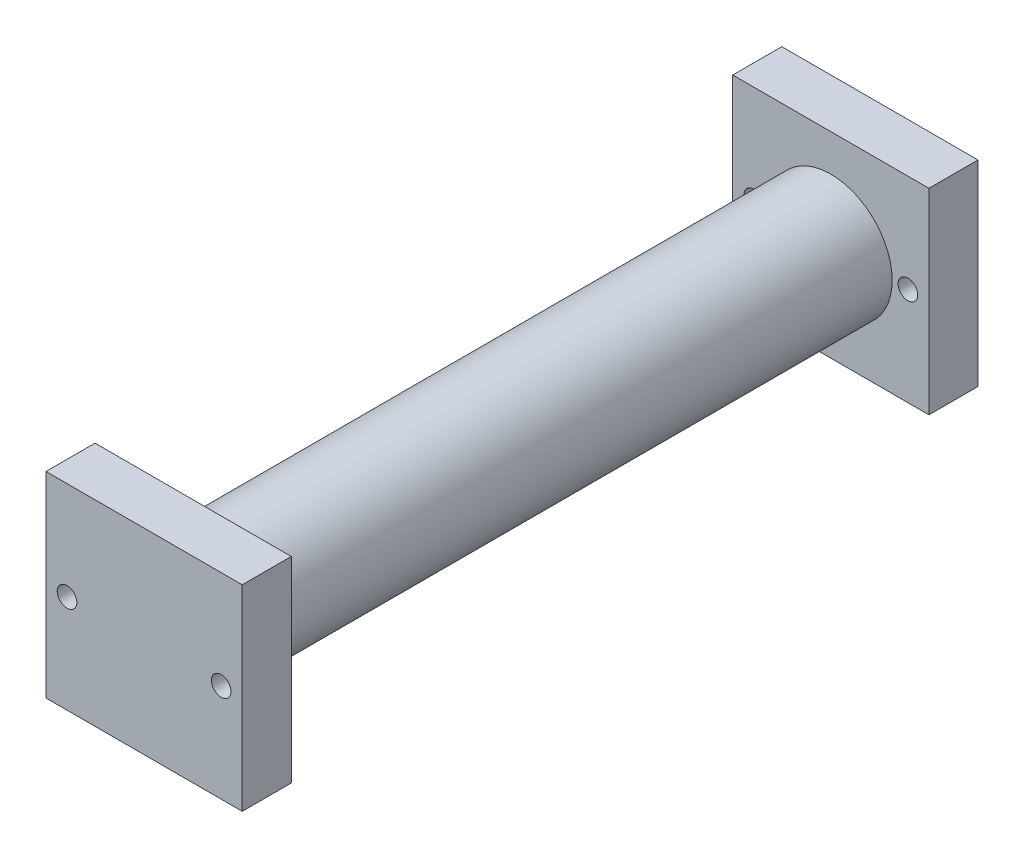
ISO-10303-21;
HEADER;
FILE_DESCRIPTION(('STEP AP214'),'2;1');
FILE_NAME('part.step','',(''),(''),'','','');
FILE_SCHEMA(('AUTOMOTIVE_DESIGN { 1 0 10303 214 1 1 1 1 }'));
ENDSEC;
DATA;
#1=APPLICATION_CONTEXT('core data for automotive mechanical design processes');
#2=APPLICATION_PROTOCOL_DEFINITION('international standard','automotive_design',2000,#1);
#3=PRODUCT_CONTEXT('',#1,'mechanical');
#4=PRODUCT('Part','Part','',(#3));
#5=PRODUCT_RELATED_PRODUCT_CATEGORY('part','',(#4));
#6=PRODUCT_DEFINITION_FORMATION('','',#4);
#7=PRODUCT_DEFINITION_CONTEXT('part definition',#1,'design');
#8=PRODUCT_DEFINITION('design','',#6,#7);
#9=PRODUCT_DEFINITION_SHAPE('','',#8);
#10=(LENGTH_UNIT() NAMED_UNIT(*) SI_UNIT(.MILLI.,.METRE.));
#11=(NAMED_UNIT(*) PLANE_ANGLE_UNIT() SI_UNIT($,.RADIAN.));
#12=(NAMED_UNIT(*) SI_UNIT($,.STERADIAN.) SOLID_ANGLE_UNIT());
#13=UNCERTAINTY_MEASURE_WITH_UNIT(LENGTH_MEASURE(1.E-05),#10,'distance_accuracy_value','');
#14=(GEOMETRIC_REPRESENTATION_CONTEXT(3) GLOBAL_UNCERTAINTY_ASSIGNED_CONTEXT((#13)) GLOBAL_UNIT_ASSIGNED_CONTEXT((#10,
#11,#12)) REPRESENTATION_CONTEXT('',''));
#15=CARTESIAN_POINT('',(0.,0.,0.));
#16=DIRECTION('',(0.,0.,1.));
#17=DIRECTION('',(1.,0.,0.));
#18=AXIS2_PLACEMENT_3D('',#15,#16,#17);
#19=CARTESIAN_POINT('',(20.,20.,10.));
#20=DIRECTION('',(-1.,0.,0.));
#21=DIRECTION('',(0.,-1.,0.));
#22=AXIS2_PLACEMENT_3D('',#19,#20,#21);
#23=PLANE('',#22);
#24=DIRECTION('',(0.,1.,0.));
#25=VECTOR('',#24,1.);
#26=CARTESIAN_POINT('',(20.,20.,0.));
#27=LINE('',#26,#25);
#28=CARTESIAN_POINT('',(20.,-20.,0.));
#29=VERTEX_POINT('',#28);
#30=CARTESIAN_POINT('',(20.,20.,0.));
#31=VERTEX_POINT('',#30);
#32=EDGE_CURVE('E137',#29,#31,#27,.T.);
#33=ORIENTED_EDGE('',*,*,#32,.T.);
#34=DIRECTION('',(0.,0.,-1.));
#35=VECTOR('',#34,1.);
#36=CARTESIAN_POINT('',(20.,20.,10.));
#37=LINE('',#36,#35);
#38=CARTESIAN_POINT('',(20.,20.,10.));
#39=VERTEX_POINT('',#38);
#40=EDGE_CURVE('E36',#39,#31,#37,.T.);
#41=ORIENTED_EDGE('',*,*,#40,.F.);
#42=DIRECTION('',(0.,1.,0.));
#43=VECTOR('',#42,1.);
#44=CARTESIAN_POINT('',(20.,20.,10.));
#45=LINE('',#44,#43);
#46=CARTESIAN_POINT('',(20.,-20.,10.));
#47=VERTEX_POINT('',#46);
#48=EDGE_CURVE('E143',#47,#39,#45,.T.);
#49=ORIENTED_EDGE('',*,*,#48,.F.);
#50=DIRECTION('',(0.,0.,-1.));
#51=VECTOR('',#50,1.);
#52=CARTESIAN_POINT('',(20.,-20.,10.));
#53=LINE('',#52,#51);
#54=EDGE_CURVE('E149',#47,#29,#53,.T.);
#55=ORIENTED_EDGE('',*,*,#54,.T.);
#56=EDGE_LOOP('',(#33,#41,#49,#55));
#57=FACE_BOUND('',#56,.T.);
#58=ADVANCED_FACE('F33',(#57),#23,.F.);
#59=CARTESIAN_POINT('',(-20.,20.,10.));
#60=DIRECTION('',(0.,-1.,0.));
#61=DIRECTION('',(0.,0.,-1.));
#62=AXIS2_PLACEMENT_3D('',#59,#60,#61);
#63=PLANE('',#62);
#64=DIRECTION('',(-1.,0.,0.));
#65=VECTOR('',#64,1.);
#66=CARTESIAN_POINT('',(-20.,20.,0.));
#67=LINE('',#66,#65);
#68=CARTESIAN_POINT('',(-20.,20.,0.));
#69=VERTEX_POINT('',#68);
#70=EDGE_CURVE('E152',#31,#69,#67,.T.);
#71=ORIENTED_EDGE('',*,*,#70,.T.);
#72=DIRECTION('',(0.,0.,-1.));
#73=VECTOR('',#72,1.);
#74=CARTESIAN_POINT('',(-20.,20.,10.));
#75=LINE('',#74,#73);
#76=CARTESIAN_POINT('',(-20.,20.,10.));
#77=VERTEX_POINT('',#76);
#78=EDGE_CURVE('E158',#77,#69,#75,.T.);
#79=ORIENTED_EDGE('',*,*,#78,.F.);
#80=DIRECTION('',(-1.,0.,0.));
#81=VECTOR('',#80,1.);
#82=CARTESIAN_POINT('',(-20.,20.,10.));
#83=LINE('',#82,#81);
#84=EDGE_CURVE('E82',#39,#77,#83,.T.);
#85=ORIENTED_EDGE('',*,*,#84,.F.);
#86=ORIENTED_EDGE('',*,*,#40,.T.);
#87=EDGE_LOOP('',(#71,#79,#85,#86));
#88=FACE_BOUND('',#87,.T.);
#89=ADVANCED_FACE('F161',(#88),#63,.F.);
#90=CARTESIAN_POINT('',(-20.,20.,10.));
#91=DIRECTION('',(1.,0.,0.));
#92=DIRECTION('',(0.,1.,0.));
#93=AXIS2_PLACEMENT_3D('',#90,#91,#92);
#94=PLANE('',#93);
#95=DIRECTION('',(0.,-1.,0.));
#96=VECTOR('',#95,1.);
#97=CARTESIAN_POINT('',(-20.,20.,0.));
#98=LINE('',#97,#96);
#99=CARTESIAN_POINT('',(-20.,-20.,0.));
#100=VERTEX_POINT('',#99);
#101=EDGE_CURVE('E68',#69,#100,#98,.T.);
#102=ORIENTED_EDGE('',*,*,#101,.T.);
#103=DIRECTION('',(0.,0.,-1.));
#104=VECTOR('',#103,1.);
#105=CARTESIAN_POINT('',(-20.,-20.,10.));
#106=LINE('',#105,#104);
#107=CARTESIAN_POINT('',(-20.,-20.,10.));
#108=VERTEX_POINT('',#107);
#109=EDGE_CURVE('E157',#108,#100,#106,.T.);
#110=ORIENTED_EDGE('',*,*,#109,.F.);
#111=DIRECTION('',(0.,-1.,0.));
#112=VECTOR('',#111,1.);
#113=CARTESIAN_POINT('',(-20.,20.,10.));
#114=LINE('',#113,#112);
#115=EDGE_CURVE('E146',#77,#108,#114,.T.);
#116=ORIENTED_EDGE('',*,*,#115,.F.);
#117=ORIENTED_EDGE('',*,*,#78,.T.);
#118=EDGE_LOOP('',(#102,#110,#116,#117));
#119=FACE_BOUND('',#118,.T.);
#120=ADVANCED_FACE('F189',(#119),#94,.F.);
#121=CARTESIAN_POINT('',(-20.,-20.,10.));
#122=DIRECTION('',(0.,1.,0.));
#123=DIRECTION('',(0.,0.,1.));
#124=AXIS2_PLACEMENT_3D('',#121,#122,#123);
#125=PLANE('',#124);
#126=DIRECTION('',(1.,0.,0.));
#127=VECTOR('',#126,1.);
#128=CARTESIAN_POINT('',(-20.,-20.,0.));
#129=LINE('',#128,#127);
#130=EDGE_CURVE('E74',#100,#29,#129,.T.);
#131=ORIENTED_EDGE('',*,*,#130,.T.);
#132=ORIENTED_EDGE('',*,*,#54,.F.);
#133=DIRECTION('',(1.,0.,0.));
#134=VECTOR('',#133,1.);
#135=CARTESIAN_POINT('',(-20.,-20.,10.));
#136=LINE('',#135,#134);
#137=EDGE_CURVE('E50',#108,#47,#136,.T.);
#138=ORIENTED_EDGE('',*,*,#137,.F.);
#139=ORIENTED_EDGE('',*,*,#109,.T.);
#140=EDGE_LOOP('',(#131,#132,#138,#139));
#141=FACE_BOUND('',#140,.T.);
#142=ADVANCED_FACE('F179',(#141),#125,.F.);
#143=CARTESIAN_POINT('',(0.,0.,10.));
#144=DIRECTION('',(0.,0.,1.));
#145=DIRECTION('',(1.,0.,0.));
#146=AXIS2_PLACEMENT_3D('',#143,#144,#145);
#147=PLANE('',#146);
#148=CARTESIAN_POINT('',(-15.71,0.,10.));
#149=DIRECTION('',(0.,0.,-1.));
#150=DIRECTION('',(-1.,0.,0.));
#151=AXIS2_PLACEMENT_3D('',#148,#149,#150);
#152=CIRCLE('',#151,2.);
#153=CARTESIAN_POINT('',(-17.71,0.,10.));
#154=VERTEX_POINT('',#153);
#155=EDGE_CURVE('E304',#154,#154,#152,.T.);
#156=ORIENTED_EDGE('',*,*,#155,.T.);
#157=EDGE_LOOP('',(#156));
#158=FACE_BOUND('',#157,.T.);
#159=CARTESIAN_POINT('',(15.71,0.,10.));
#160=DIRECTION('',(0.,0.,-1.));
#161=DIRECTION('',(-1.,0.,0.));
#162=AXIS2_PLACEMENT_3D('',#159,#160,#161);
#163=CIRCLE('',#162,2.);
#164=CARTESIAN_POINT('',(13.71,0.,10.));
#165=VERTEX_POINT('',#164);
#166=EDGE_CURVE('E311',#165,#165,#163,.T.);
#167=ORIENTED_EDGE('',*,*,#166,.T.);
#168=EDGE_LOOP('',(#167));
#169=FACE_BOUND('',#168,.T.);
#170=CARTESIAN_POINT('',(0.,0.,10.));
#171=DIRECTION('',(0.,0.,1.));
#172=DIRECTION('',(1.,0.,0.));
#173=AXIS2_PLACEMENT_3D('',#170,#171,#172);
#174=CIRCLE('',#173,12.5);
#175=CARTESIAN_POINT('',(12.5,0.,10.));
#176=VERTEX_POINT('',#175);
#177=EDGE_CURVE('E11',#176,#176,#174,.T.);
#178=ORIENTED_EDGE('',*,*,#177,.F.);
#179=EDGE_LOOP('',(#178));
#180=FACE_BOUND('',#179,.T.);
#181=ORIENTED_EDGE('',*,*,#48,.T.);
#182=ORIENTED_EDGE('',*,*,#84,.T.);
#183=ORIENTED_EDGE('',*,*,#115,.T.);
#184=ORIENTED_EDGE('',*,*,#137,.T.);
#185=EDGE_LOOP('',(#181,#182,#183,#184));
#186=FACE_BOUND('',#185,.T.);
#187=ADVANCED_FACE('F169',(#158,#169,#180,#186),#147,.T.);
#188=CARTESIAN_POINT('',(0.,0.,0.));
#189=DIRECTION('',(0.,0.,1.));
#190=DIRECTION('',(1.,0.,0.));
#191=AXIS2_PLACEMENT_3D('',#188,#189,#190);
#192=PLANE('',#191);
#193=CARTESIAN_POINT('',(-15.71,0.,0.));
#194=DIRECTION('',(0.,0.,-1.));
#195=DIRECTION('',(-1.,0.,0.));
#196=AXIS2_PLACEMENT_3D('',#193,#194,#195);
#197=CIRCLE('',#196,2.);
#198=CARTESIAN_POINT('',(-17.71,0.,0.));
#199=VERTEX_POINT('',#198);
#200=EDGE_CURVE('E306',#199,#199,#197,.T.);
#201=ORIENTED_EDGE('',*,*,#200,.F.);
#202=EDGE_LOOP('',(#201));
#203=FACE_BOUND('',#202,.T.);
#204=CARTESIAN_POINT('',(15.71,0.,0.));
#205=DIRECTION('',(0.,0.,-1.));
#206=DIRECTION('',(-1.,0.,0.));
#207=AXIS2_PLACEMENT_3D('',#204,#205,#206);
#208=CIRCLE('',#207,2.);
#209=CARTESIAN_POINT('',(13.71,0.,0.));
#210=VERTEX_POINT('',#209);
#211=EDGE_CURVE('E308',#210,#210,#208,.T.);
#212=ORIENTED_EDGE('',*,*,#211,.F.);
#213=EDGE_LOOP('',(#212));
#214=FACE_BOUND('',#213,.T.);
#215=ORIENTED_EDGE('',*,*,#32,.F.);
#216=ORIENTED_EDGE('',*,*,#130,.F.);
#217=ORIENTED_EDGE('',*,*,#101,.F.);
#218=ORIENTED_EDGE('',*,*,#70,.F.);
#219=EDGE_LOOP('',(#215,#216,#217,#218));
#220=FACE_BOUND('',#219,.T.);
#221=ADVANCED_FACE('F166',(#203,#214,#220),#192,.F.);
#222=CARTESIAN_POINT('',(0.,0.,140.));
#223=DIRECTION('',(0.,0.,-1.));
#224=DIRECTION('',(-1.,0.,0.));
#225=AXIS2_PLACEMENT_3D('',#222,#223,#224);
#226=CYLINDRICAL_SURFACE('',#225,12.5);
#227=CARTESIAN_POINT('',(0.,0.,140.));
#228=DIRECTION('',(0.,0.,1.));
#229=DIRECTION('',(1.,0.,0.));
#230=AXIS2_PLACEMENT_3D('',#227,#228,#229);
#231=CIRCLE('',#230,12.5);
#232=CARTESIAN_POINT('',(12.5,0.,140.));
#233=VERTEX_POINT('',#232);
#234=EDGE_CURVE('E134',#233,#233,#231,.T.);
#235=ORIENTED_EDGE('',*,*,#234,.F.);
#236=EDGE_LOOP('',(#235));
#237=FACE_BOUND('',#236,.T.);
#238=ORIENTED_EDGE('',*,*,#177,.T.);
#239=EDGE_LOOP('',(#238));
#240=FACE_BOUND('',#239,.T.);
#241=ADVANCED_FACE('F168',(#237,#240),#226,.T.);
#242=CARTESIAN_POINT('',(20.,20.,150.));
#243=DIRECTION('',(-1.,0.,0.));
#244=DIRECTION('',(0.,-1.,0.));
#245=AXIS2_PLACEMENT_3D('',#242,#243,#244);
#246=PLANE('',#245);
#247=DIRECTION('',(0.,1.,0.));
#248=VECTOR('',#247,1.);
#249=CARTESIAN_POINT('',(20.,20.,140.));
#250=LINE('',#249,#248);
#251=CARTESIAN_POINT('',(20.,-20.,140.));
#252=VERTEX_POINT('',#251);
#253=CARTESIAN_POINT('',(20.,20.,140.));
#254=VERTEX_POINT('',#253);
#255=EDGE_CURVE('E133',#252,#254,#250,.T.);
#256=ORIENTED_EDGE('',*,*,#255,.T.);
#257=DIRECTION('',(0.,0.,-1.));
#258=VECTOR('',#257,1.);
#259=CARTESIAN_POINT('',(20.,20.,150.));
#260=LINE('',#259,#258);
#261=CARTESIAN_POINT('',(20.,20.,150.));
#262=VERTEX_POINT('',#261);
#263=EDGE_CURVE('E113',#262,#254,#260,.T.);
#264=ORIENTED_EDGE('',*,*,#263,.F.);
#265=DIRECTION('',(0.,1.,0.));
#266=VECTOR('',#265,1.);
#267=CARTESIAN_POINT('',(20.,20.,150.));
#268=LINE('',#267,#266);
#269=CARTESIAN_POINT('',(20.,-20.,150.));
#270=VERTEX_POINT('',#269);
#271=EDGE_CURVE('E120',#270,#262,#268,.T.);
#272=ORIENTED_EDGE('',*,*,#271,.F.);
#273=DIRECTION('',(0.,0.,-1.));
#274=VECTOR('',#273,1.);
#275=CARTESIAN_POINT('',(20.,-20.,150.));
#276=LINE('',#275,#274);
#277=EDGE_CURVE('E330',#270,#252,#276,.T.);
#278=ORIENTED_EDGE('',*,*,#277,.T.);
#279=EDGE_LOOP('',(#256,#264,#272,#278));
#280=FACE_BOUND('',#279,.T.);
#281=ADVANCED_FACE('F131',(#280),#246,.F.);
#282=CARTESIAN_POINT('',(-20.,20.,150.));
#283=DIRECTION('',(0.,-1.,0.));
#284=DIRECTION('',(0.,0.,-1.));
#285=AXIS2_PLACEMENT_3D('',#282,#283,#284);
#286=PLANE('',#285);
#287=DIRECTION('',(-1.,0.,0.));
#288=VECTOR('',#287,1.);
#289=CARTESIAN_POINT('',(-20.,20.,140.));
#290=LINE('',#289,#288);
#291=CARTESIAN_POINT('',(-20.,20.,140.));
#292=VERTEX_POINT('',#291);
#293=EDGE_CURVE('E332',#254,#292,#290,.T.);
#294=ORIENTED_EDGE('',*,*,#293,.T.);
#295=DIRECTION('',(0.,0.,-1.));
#296=VECTOR('',#295,1.);
#297=CARTESIAN_POINT('',(-20.,20.,150.));
#298=LINE('',#297,#296);
#299=CARTESIAN_POINT('',(-20.,20.,150.));
#300=VERTEX_POINT('',#299);
#301=EDGE_CURVE('E116',#300,#292,#298,.T.);
#302=ORIENTED_EDGE('',*,*,#301,.F.);
#303=DIRECTION('',(-1.,0.,0.));
#304=VECTOR('',#303,1.);
#305=CARTESIAN_POINT('',(-20.,20.,150.));
#306=LINE('',#305,#304);
#307=EDGE_CURVE('E109',#262,#300,#306,.T.);
#308=ORIENTED_EDGE('',*,*,#307,.F.);
#309=ORIENTED_EDGE('',*,*,#263,.T.);
#310=EDGE_LOOP('',(#294,#302,#308,#309));
#311=FACE_BOUND('',#310,.T.);
#312=ADVANCED_FACE('F111',(#311),#286,.F.);
#313=CARTESIAN_POINT('',(-20.,20.,150.));
#314=DIRECTION('',(1.,0.,0.));
#315=DIRECTION('',(0.,1.,0.));
#316=AXIS2_PLACEMENT_3D('',#313,#314,#315);
#317=PLANE('',#316);
#318=DIRECTION('',(0.,-1.,0.));
#319=VECTOR('',#318,1.);
#320=CARTESIAN_POINT('',(-20.,20.,140.));
#321=LINE('',#320,#319);
#322=CARTESIAN_POINT('',(-20.,-20.,140.));
#323=VERTEX_POINT('',#322);
#324=EDGE_CURVE('E334',#292,#323,#321,.T.);
#325=ORIENTED_EDGE('',*,*,#324,.T.);
#326=DIRECTION('',(0.,0.,-1.));
#327=VECTOR('',#326,1.);
#328=CARTESIAN_POINT('',(-20.,-20.,150.));
#329=LINE('',#328,#327);
#330=CARTESIAN_POINT('',(-20.,-20.,150.));
#331=VERTEX_POINT('',#330);
#332=EDGE_CURVE('E139',#331,#323,#329,.T.);
#333=ORIENTED_EDGE('',*,*,#332,.F.);
#334=DIRECTION('',(0.,-1.,0.));
#335=VECTOR('',#334,1.);
#336=CARTESIAN_POINT('',(-20.,20.,150.));
#337=LINE('',#336,#335);
#338=EDGE_CURVE('E119',#300,#331,#337,.T.);
#339=ORIENTED_EDGE('',*,*,#338,.F.);
#340=ORIENTED_EDGE('',*,*,#301,.T.);
#341=EDGE_LOOP('',(#325,#333,#339,#340));
#342=FACE_BOUND('',#341,.T.);
#343=ADVANCED_FACE('F226',(#342),#317,.F.);
#344=CARTESIAN_POINT('',(-20.,-20.,150.));
#345=DIRECTION('',(0.,1.,0.));
#346=DIRECTION('',(0.,0.,1.));
#347=AXIS2_PLACEMENT_3D('',#344,#345,#346);
#348=PLANE('',#347);
#349=DIRECTION('',(1.,0.,0.));
#350=VECTOR('',#349,1.);
#351=CARTESIAN_POINT('',(-20.,-20.,140.));
#352=LINE('',#351,#350);
#353=EDGE_CURVE('E129',#323,#252,#352,.T.);
#354=ORIENTED_EDGE('',*,*,#353,.T.);
#355=ORIENTED_EDGE('',*,*,#277,.F.);
#356=DIRECTION('',(1.,0.,0.));
#357=VECTOR('',#356,1.);
#358=CARTESIAN_POINT('',(-20.,-20.,150.));
#359=LINE('',#358,#357);
#360=EDGE_CURVE('E125',#331,#270,#359,.T.);
#361=ORIENTED_EDGE('',*,*,#360,.F.);
#362=ORIENTED_EDGE('',*,*,#332,.T.);
#363=EDGE_LOOP('',(#354,#355,#361,#362));
#364=FACE_BOUND('',#363,.T.);
#365=ADVANCED_FACE('F233',(#364),#348,.F.);
#366=CARTESIAN_POINT('',(0.,0.,150.));
#367=DIRECTION('',(0.,0.,1.));
#368=DIRECTION('',(1.,0.,0.));
#369=AXIS2_PLACEMENT_3D('',#366,#367,#368);
#370=PLANE('',#369);
#371=CARTESIAN_POINT('',(15.71,0.,150.));
#372=DIRECTION('',(0.,0.,1.));
#373=DIRECTION('',(1.,0.,0.));
#374=AXIS2_PLACEMENT_3D('',#371,#372,#373);
#375=CIRCLE('',#374,2.);
#376=CARTESIAN_POINT('',(17.71,0.,150.));
#377=VERTEX_POINT('',#376);
#378=EDGE_CURVE('E314',#377,#377,#375,.T.);
#379=ORIENTED_EDGE('',*,*,#378,.F.);
#380=EDGE_LOOP('',(#379));
#381=FACE_BOUND('',#380,.T.);
#382=CARTESIAN_POINT('',(-15.7139575276235,0.,150.));
#383=DIRECTION('',(0.,0.,1.));
#384=DIRECTION('',(1.,0.,0.));
#385=AXIS2_PLACEMENT_3D('',#382,#383,#384);
#386=CIRCLE('',#385,2.);
#387=CARTESIAN_POINT('',(-13.7139575276235,0.,150.));
#388=VERTEX_POINT('',#387);
#389=EDGE_CURVE('E320',#388,#388,#386,.T.);
#390=ORIENTED_EDGE('',*,*,#389,.F.);
#391=EDGE_LOOP('',(#390));
#392=FACE_BOUND('',#391,.T.);
#393=ORIENTED_EDGE('',*,*,#271,.T.);
#394=ORIENTED_EDGE('',*,*,#307,.T.);
#395=ORIENTED_EDGE('',*,*,#338,.T.);
#396=ORIENTED_EDGE('',*,*,#360,.T.);
#397=EDGE_LOOP('',(#393,#394,#395,#396));
#398=FACE_BOUND('',#397,.T.);
#399=ADVANCED_FACE('F123',(#381,#392,#398),#370,.T.);
#400=CARTESIAN_POINT('',(0.,0.,140.));
#401=DIRECTION('',(0.,0.,1.));
#402=DIRECTION('',(1.,0.,0.));
#403=AXIS2_PLACEMENT_3D('',#400,#401,#402);
#404=PLANE('',#403);
#405=CARTESIAN_POINT('',(15.71,0.,140.));
#406=DIRECTION('',(0.,0.,1.));
#407=DIRECTION('',(1.,0.,0.));
#408=AXIS2_PLACEMENT_3D('',#405,#406,#407);
#409=CIRCLE('',#408,2.);
#410=CARTESIAN_POINT('',(17.71,0.,140.));
#411=VERTEX_POINT('',#410);
#412=EDGE_CURVE('E317',#411,#411,#409,.T.);
#413=ORIENTED_EDGE('',*,*,#412,.T.);
#414=EDGE_LOOP('',(#413));
#415=FACE_BOUND('',#414,.T.);
#416=CARTESIAN_POINT('',(-15.7139575276235,0.,140.));
#417=DIRECTION('',(0.,0.,1.));
#418=DIRECTION('',(1.,0.,0.));
#419=AXIS2_PLACEMENT_3D('',#416,#417,#418);
#420=CIRCLE('',#419,2.);
#421=CARTESIAN_POINT('',(-13.7139575276235,0.,140.));
#422=VERTEX_POINT('',#421);
#423=EDGE_CURVE('E323',#422,#422,#420,.T.);
#424=ORIENTED_EDGE('',*,*,#423,.T.);
#425=EDGE_LOOP('',(#424));
#426=FACE_BOUND('',#425,.T.);
#427=ORIENTED_EDGE('',*,*,#234,.T.);
#428=EDGE_LOOP('',(#427));
#429=FACE_BOUND('',#428,.T.);
#430=ORIENTED_EDGE('',*,*,#255,.F.);
#431=ORIENTED_EDGE('',*,*,#353,.F.);
#432=ORIENTED_EDGE('',*,*,#324,.F.);
#433=ORIENTED_EDGE('',*,*,#293,.F.);
#434=EDGE_LOOP('',(#430,#431,#432,#433));
#435=FACE_BOUND('',#434,.T.);
#436=ADVANCED_FACE('F250',(#415,#426,#429,#435),#404,.F.);
#437=CARTESIAN_POINT('',(-15.7139575276235,0.,140.));
#438=DIRECTION('',(0.,0.,1.));
#439=DIRECTION('',(1.,0.,0.));
#440=AXIS2_PLACEMENT_3D('',#437,#438,#439);
#441=CYLINDRICAL_SURFACE('',#440,2.);
#442=ORIENTED_EDGE('',*,*,#423,.F.);
#443=EDGE_LOOP('',(#442));
#444=FACE_BOUND('',#443,.T.);
#445=ORIENTED_EDGE('',*,*,#389,.T.);
#446=EDGE_LOOP('',(#445));
#447=FACE_BOUND('',#446,.T.);
#448=ADVANCED_FACE('F260',(#444,#447),#441,.F.);
#449=CARTESIAN_POINT('',(15.71,0.,140.));
#450=DIRECTION('',(0.,0.,1.));
#451=DIRECTION('',(1.,0.,0.));
#452=AXIS2_PLACEMENT_3D('',#449,#450,#451);
#453=CYLINDRICAL_SURFACE('',#452,2.);
#454=ORIENTED_EDGE('',*,*,#412,.F.);
#455=EDGE_LOOP('',(#454));
#456=FACE_BOUND('',#455,.T.);
#457=ORIENTED_EDGE('',*,*,#378,.T.);
#458=EDGE_LOOP('',(#457));
#459=FACE_BOUND('',#458,.T.);
#460=ADVANCED_FACE('F270',(#456,#459),#453,.F.);
#461=CARTESIAN_POINT('',(15.71,0.,10.));
#462=DIRECTION('',(0.,0.,-1.));
#463=DIRECTION('',(-1.,0.,0.));
#464=AXIS2_PLACEMENT_3D('',#461,#462,#463);
#465=CYLINDRICAL_SURFACE('',#464,2.);
#466=ORIENTED_EDGE('',*,*,#166,.F.);
#467=EDGE_LOOP('',(#466));
#468=FACE_BOUND('',#467,.T.);
#469=ORIENTED_EDGE('',*,*,#211,.T.);
#470=EDGE_LOOP('',(#469));
#471=FACE_BOUND('',#470,.T.);
#472=ADVANCED_FACE('F276',(#468,#471),#465,.F.);
#473=CARTESIAN_POINT('',(-15.71,0.,10.));
#474=DIRECTION('',(0.,0.,-1.));
#475=DIRECTION('',(-1.,0.,0.));
#476=AXIS2_PLACEMENT_3D('',#473,#474,#475);
#477=CYLINDRICAL_SURFACE('',#476,2.);
#478=ORIENTED_EDGE('',*,*,#155,.F.);
#479=EDGE_LOOP('',(#478));
#480=FACE_BOUND('',#479,.T.);
#481=ORIENTED_EDGE('',*,*,#200,.T.);
#482=EDGE_LOOP('',(#481));
#483=FACE_BOUND('',#482,.T.);
#484=ADVANCED_FACE('F283',(#480,#483),#477,.F.);
#485=CLOSED_SHELL('',(#58,#89,#120,#142,#187,#221,#241,#281,#312,#343,#365,#399,#436,#448,#460,
#472,#484));
#486=MANIFOLD_SOLID_BREP('B2',#485);
#487=ADVANCED_BREP_SHAPE_REPRESENTATION('',(#18,#486),#14);
#488=SHAPE_DEFINITION_REPRESENTATION(#9,#487);
ENDSEC;
END-ISO-10303-21;
